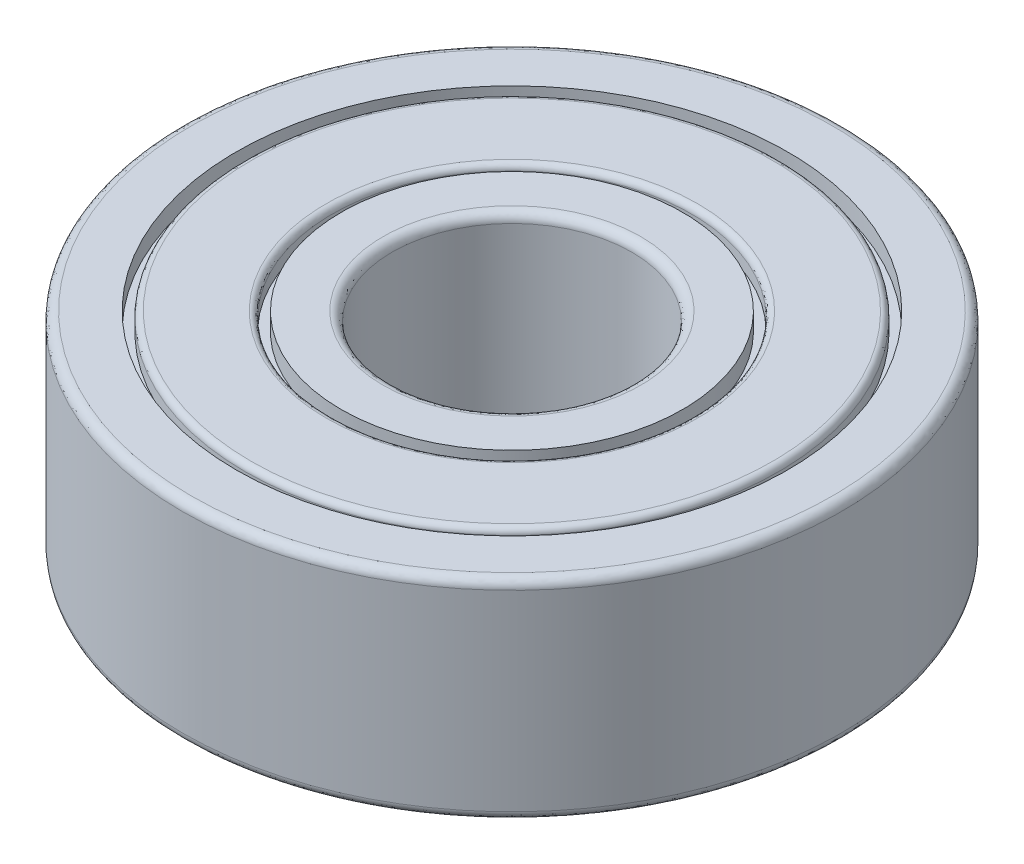
ISO-10303-21;
HEADER;
FILE_DESCRIPTION(('STEP AP214'),'2;1');
FILE_NAME('part.step','',(''),(''),'','','');
FILE_SCHEMA(('AUTOMOTIVE_DESIGN { 1 0 10303 214 1 1 1 1 }'));
ENDSEC;
DATA;
#1=APPLICATION_CONTEXT('core data for automotive mechanical design processes');
#2=APPLICATION_PROTOCOL_DEFINITION('international standard','automotive_design',2000,#1);
#3=PRODUCT_CONTEXT('',#1,'mechanical');
#4=PRODUCT('Part','Part','',(#3));
#5=PRODUCT_RELATED_PRODUCT_CATEGORY('part','',(#4));
#6=PRODUCT_DEFINITION_FORMATION('','',#4);
#7=PRODUCT_DEFINITION_CONTEXT('part definition',#1,'design');
#8=PRODUCT_DEFINITION('design','',#6,#7);
#9=PRODUCT_DEFINITION_SHAPE('','',#8);
#10=(LENGTH_UNIT() NAMED_UNIT(*) SI_UNIT(.MILLI.,.METRE.));
#11=(NAMED_UNIT(*) PLANE_ANGLE_UNIT() SI_UNIT($,.RADIAN.));
#12=(NAMED_UNIT(*) SI_UNIT($,.STERADIAN.) SOLID_ANGLE_UNIT());
#13=UNCERTAINTY_MEASURE_WITH_UNIT(LENGTH_MEASURE(1.E-05),#10,'distance_accuracy_value','');
#14=(GEOMETRIC_REPRESENTATION_CONTEXT(3) GLOBAL_UNCERTAINTY_ASSIGNED_CONTEXT((#13)) GLOBAL_UNIT_ASSIGNED_CONTEXT((#10,
#11,#12)) REPRESENTATION_CONTEXT('',''));
#15=CARTESIAN_POINT('',(0.,0.,0.));
#16=DIRECTION('',(0.,0.,1.));
#17=DIRECTION('',(1.,0.,0.));
#18=AXIS2_PLACEMENT_3D('',#15,#16,#17);
#19=CARTESIAN_POINT('',(0.,3.2,0.));
#20=DIRECTION('',(0.,-1.,0.));
#21=DIRECTION('',(0.,0.,1.));
#22=AXIS2_PLACEMENT_3D('',#19,#20,#21);
#23=CYLINDRICAL_SURFACE('',#22,4.);
#24=CARTESIAN_POINT('',(0.,3.2,0.));
#25=DIRECTION('',(0.,1.,0.));
#26=DIRECTION('',(0.,0.,1.));
#27=AXIS2_PLACEMENT_3D('',#24,#25,#26);
#28=CIRCLE('',#27,4.);
#29=CARTESIAN_POINT('',(0.,3.2,4.));
#30=VERTEX_POINT('',#29);
#31=EDGE_CURVE('E212',#30,#30,#28,.T.);
#32=ORIENTED_EDGE('',*,*,#31,.T.);
#33=CARTESIAN_POINT('',(0.,3.2,4.));
#34=CARTESIAN_POINT('',(0.,-3.2,4.));
#35=(BOUNDED_CURVE() B_SPLINE_CURVE(1,(#33,#34),.UNSPECIFIED.,.F.,
.F.) B_SPLINE_CURVE_WITH_KNOTS((2,2),(0.,6.4),
.UNSPECIFIED.) CURVE() GEOMETRIC_REPRESENTATION_ITEM() RATIONAL_B_SPLINE_CURVE((1.,1.)) REPRESENTATION_ITEM(''));
#36=CARTESIAN_POINT('',(0.,-3.2,4.));
#37=VERTEX_POINT('',#36);
#38=EDGE_CURVE('E11',#30,#37,#35,.T.);
#39=ORIENTED_EDGE('',*,*,#38,.T.);
#40=CARTESIAN_POINT('',(0.,-3.2,0.));
#41=DIRECTION('',(0.,1.,0.));
#42=DIRECTION('',(0.,0.,1.));
#43=AXIS2_PLACEMENT_3D('',#40,#41,#42);
#44=CIRCLE('',#43,4.);
#45=EDGE_CURVE('E237',#37,#37,#44,.T.);
#46=ORIENTED_EDGE('',*,*,#45,.F.);
#47=ORIENTED_EDGE('',*,*,#38,.F.);
#48=EDGE_LOOP('',(#32,#39,#46,#47));
#49=FACE_BOUND('',#48,.T.);
#50=ADVANCED_FACE('F16',(#49),#23,.F.);
#51=CARTESIAN_POINT('',(0.,-3.2,4.));
#52=CARTESIAN_POINT('',(0.,-3.37573593128807,4.));
#53=CARTESIAN_POINT('',(0.,-3.5,4.12426406871193));
#54=CARTESIAN_POINT('',(0.,-3.5,4.3));
#55=(BOUNDED_CURVE() B_SPLINE_CURVE(3,(#51,#52,#53,#54),.UNSPECIFIED.,.F.,
.F.) B_SPLINE_CURVE_WITH_KNOTS((4,4),(0.,1.),
.UNSPECIFIED.) CURVE() GEOMETRIC_REPRESENTATION_ITEM() RATIONAL_B_SPLINE_CURVE((1.,
0.804737854124365,0.804737854124365,1.)) REPRESENTATION_ITEM(''));
#56=CARTESIAN_POINT('',(0.,0.,0.));
#57=DIRECTION('',(0.,-1.,0.));
#58=AXIS1_PLACEMENT('',#56,#57);
#59=SURFACE_OF_REVOLUTION('',#55,#58);
#60=ORIENTED_EDGE('',*,*,#45,.T.);
#61=CARTESIAN_POINT('',(0.,-3.2,4.3));
#62=DIRECTION('',(-1.,0.,0.));
#63=DIRECTION('',(0.,-1.,0.));
#64=AXIS2_PLACEMENT_3D('',#61,#62,#63);
#65=CIRCLE('',#64,0.3);
#66=CARTESIAN_POINT('',(0.,-3.5,4.3));
#67=VERTEX_POINT('',#66);
#68=EDGE_CURVE('E29',#37,#67,#65,.T.);
#69=ORIENTED_EDGE('',*,*,#68,.T.);
#70=CARTESIAN_POINT('',(0.,-3.5,0.));
#71=DIRECTION('',(0.,1.,0.));
#72=DIRECTION('',(0.,0.,1.));
#73=AXIS2_PLACEMENT_3D('',#70,#71,#72);
#74=CIRCLE('',#73,4.3);
#75=EDGE_CURVE('E671',#67,#67,#74,.T.);
#76=ORIENTED_EDGE('',*,*,#75,.F.);
#77=ORIENTED_EDGE('',*,*,#68,.F.);
#78=EDGE_LOOP('',(#60,#69,#76,#77));
#79=FACE_BOUND('',#78,.T.);
#80=ADVANCED_FACE('F254',(#79),#59,.F.);
#81=CARTESIAN_POINT('',(0.,-3.5,0.));
#82=DIRECTION('',(0.,-1.,0.));
#83=DIRECTION('',(-1.,0.,0.));
#84=AXIS2_PLACEMENT_3D('',#81,#82,#83);
#85=PLANE('',#84);
#86=ORIENTED_EDGE('',*,*,#75,.T.);
#87=EDGE_LOOP('',(#86));
#88=FACE_BOUND('',#87,.T.);
#89=CARTESIAN_POINT('',(0.,-3.5,0.));
#90=DIRECTION('',(0.,1.,0.));
#91=DIRECTION('',(0.,0.,1.));
#92=AXIS2_PLACEMENT_3D('',#89,#90,#91);
#93=CIRCLE('',#92,5.7);
#94=CARTESIAN_POINT('',(0.,-3.5,5.7));
#95=VERTEX_POINT('',#94);
#96=EDGE_CURVE('E227',#95,#95,#93,.T.);
#97=ORIENTED_EDGE('',*,*,#96,.F.);
#98=EDGE_LOOP('',(#97));
#99=FACE_BOUND('',#98,.T.);
#100=ADVANCED_FACE('F258',(#88,#99),#85,.T.);
#101=CARTESIAN_POINT('',(0.,-2.9,0.));
#102=DIRECTION('',(0.,-1.,0.));
#103=DIRECTION('',(0.,0.,1.));
#104=AXIS2_PLACEMENT_3D('',#101,#102,#103);
#105=CYLINDRICAL_SURFACE('',#104,5.7);
#106=DIRECTION('',(0.,-1.,0.));
#107=VECTOR('',#106,1.);
#108=CARTESIAN_POINT('',(0.,-2.9,5.7));
#109=LINE('',#108,#107);
#110=CARTESIAN_POINT('',(0.,-2.9,5.7));
#111=VERTEX_POINT('',#110);
#112=EDGE_CURVE('E223',#111,#95,#109,.T.);
#113=ORIENTED_EDGE('',*,*,#112,.T.);
#114=ORIENTED_EDGE('',*,*,#96,.T.);
#115=ORIENTED_EDGE('',*,*,#112,.F.);
#116=CARTESIAN_POINT('',(0.,-2.9,0.));
#117=DIRECTION('',(0.,1.,0.));
#118=DIRECTION('',(0.,0.,1.));
#119=AXIS2_PLACEMENT_3D('',#116,#117,#118);
#120=CIRCLE('',#119,5.7);
#121=EDGE_CURVE('E228',#111,#111,#120,.T.);
#122=ORIENTED_EDGE('',*,*,#121,.F.);
#123=EDGE_LOOP('',(#113,#114,#115,#122));
#124=FACE_BOUND('',#123,.T.);
#125=ADVANCED_FACE('F366',(#124),#105,.T.);
#126=CARTESIAN_POINT('',(0.,-2.9,0.));
#127=DIRECTION('',(0.,-1.,0.));
#128=DIRECTION('',(-1.,0.,0.));
#129=AXIS2_PLACEMENT_3D('',#126,#127,#128);
#130=PLANE('',#129);
#131=ORIENTED_EDGE('',*,*,#121,.T.);
#132=EDGE_LOOP('',(#131));
#133=FACE_BOUND('',#132,.T.);
#134=CARTESIAN_POINT('',(0.,-2.9,0.));
#135=DIRECTION('',(0.,1.,0.));
#136=DIRECTION('',(0.,0.,1.));
#137=AXIS2_PLACEMENT_3D('',#134,#135,#136);
#138=CIRCLE('',#137,6.);
#139=CARTESIAN_POINT('',(0.,-2.9,6.));
#140=VERTEX_POINT('',#139);
#141=EDGE_CURVE('E123',#140,#140,#138,.T.);
#142=ORIENTED_EDGE('',*,*,#141,.F.);
#143=EDGE_LOOP('',(#142));
#144=FACE_BOUND('',#143,.T.);
#145=ADVANCED_FACE('F364',(#133,#144),#130,.T.);
#146=CARTESIAN_POINT('',(0.,-3.3,0.));
#147=DIRECTION('',(0.,1.,0.));
#148=DIRECTION('',(0.,0.,1.));
#149=AXIS2_PLACEMENT_3D('',#146,#147,#148);
#150=CYLINDRICAL_SURFACE('',#149,6.);
#151=DIRECTION('',(0.,1.,0.));
#152=VECTOR('',#151,1.);
#153=CARTESIAN_POINT('',(0.,-3.3,6.));
#154=LINE('',#153,#152);
#155=CARTESIAN_POINT('',(0.,-3.3,6.));
#156=VERTEX_POINT('',#155);
#157=EDGE_CURVE('E130',#156,#140,#154,.T.);
#158=ORIENTED_EDGE('',*,*,#157,.T.);
#159=ORIENTED_EDGE('',*,*,#141,.T.);
#160=ORIENTED_EDGE('',*,*,#157,.F.);
#161=CARTESIAN_POINT('',(0.,-3.3,0.));
#162=DIRECTION('',(0.,1.,0.));
#163=DIRECTION('',(0.,0.,1.));
#164=AXIS2_PLACEMENT_3D('',#161,#162,#163);
#165=CIRCLE('',#164,6.);
#166=EDGE_CURVE('E220',#156,#156,#165,.T.);
#167=ORIENTED_EDGE('',*,*,#166,.F.);
#168=EDGE_LOOP('',(#158,#159,#160,#167));
#169=FACE_BOUND('',#168,.T.);
#170=ADVANCED_FACE('F266',(#169),#150,.F.);
#171=CARTESIAN_POINT('',(0.,-3.3,6.));
#172=CARTESIAN_POINT('',(0.,-3.41715728752538,6.));
#173=CARTESIAN_POINT('',(0.,-3.5,6.08284271247462));
#174=CARTESIAN_POINT('',(0.,-3.5,6.2));
#175=(BOUNDED_CURVE() B_SPLINE_CURVE(3,(#171,#172,#173,#174),.UNSPECIFIED.,.F.,
.F.) B_SPLINE_CURVE_WITH_KNOTS((4,4),(0.,1.),
.UNSPECIFIED.) CURVE() GEOMETRIC_REPRESENTATION_ITEM() RATIONAL_B_SPLINE_CURVE((1.,
0.804737854124365,0.804737854124365,1.)) REPRESENTATION_ITEM(''));
#176=CARTESIAN_POINT('',(0.,0.,0.));
#177=DIRECTION('',(0.,-1.,0.));
#178=AXIS1_PLACEMENT('',#176,#177);
#179=SURFACE_OF_REVOLUTION('',#175,#178);
#180=ORIENTED_EDGE('',*,*,#166,.T.);
#181=CARTESIAN_POINT('',(0.,-3.3,6.2));
#182=DIRECTION('',(-1.,0.,0.));
#183=DIRECTION('',(0.,-1.,0.));
#184=AXIS2_PLACEMENT_3D('',#181,#182,#183);
#185=CIRCLE('',#184,0.2);
#186=CARTESIAN_POINT('',(0.,-3.5,6.2));
#187=VERTEX_POINT('',#186);
#188=EDGE_CURVE('E217',#156,#187,#185,.T.);
#189=ORIENTED_EDGE('',*,*,#188,.T.);
#190=CARTESIAN_POINT('',(0.,-3.5,0.));
#191=DIRECTION('',(0.,1.,0.));
#192=DIRECTION('',(0.,0.,1.));
#193=AXIS2_PLACEMENT_3D('',#190,#191,#192);
#194=CIRCLE('',#193,6.2);
#195=EDGE_CURVE('E641',#187,#187,#194,.T.);
#196=ORIENTED_EDGE('',*,*,#195,.F.);
#197=ORIENTED_EDGE('',*,*,#188,.F.);
#198=EDGE_LOOP('',(#180,#189,#196,#197));
#199=FACE_BOUND('',#198,.T.);
#200=ADVANCED_FACE('F262',(#199),#179,.F.);
#201=CARTESIAN_POINT('',(0.,-3.5,0.));
#202=DIRECTION('',(0.,-1.,0.));
#203=DIRECTION('',(-1.,0.,0.));
#204=AXIS2_PLACEMENT_3D('',#201,#202,#203);
#205=PLANE('',#204);
#206=ORIENTED_EDGE('',*,*,#195,.T.);
#207=EDGE_LOOP('',(#206));
#208=FACE_BOUND('',#207,.T.);
#209=CARTESIAN_POINT('',(0.,-3.5,0.));
#210=DIRECTION('',(0.,1.,0.));
#211=DIRECTION('',(0.,0.,1.));
#212=AXIS2_PLACEMENT_3D('',#209,#210,#211);
#213=CIRCLE('',#212,8.7);
#214=CARTESIAN_POINT('',(0.,-3.5,8.7));
#215=VERTEX_POINT('',#214);
#216=EDGE_CURVE('E229',#215,#215,#213,.T.);
#217=ORIENTED_EDGE('',*,*,#216,.F.);
#218=EDGE_LOOP('',(#217));
#219=FACE_BOUND('',#218,.T.);
#220=ADVANCED_FACE('F265',(#208,#219),#205,.T.);
#221=CARTESIAN_POINT('',(0.,-3.5,8.7));
#222=CARTESIAN_POINT('',(0.,-3.5,8.81715728752539));
#223=CARTESIAN_POINT('',(0.,-3.41715728752538,8.9));
#224=CARTESIAN_POINT('',(0.,-3.3,8.9));
#225=(BOUNDED_CURVE() B_SPLINE_CURVE(3,(#221,#222,#223,#224),.UNSPECIFIED.,.F.,
.F.) B_SPLINE_CURVE_WITH_KNOTS((4,4),(0.,1.),
.UNSPECIFIED.) CURVE() GEOMETRIC_REPRESENTATION_ITEM() RATIONAL_B_SPLINE_CURVE((1.,
0.804737854124365,0.804737854124365,1.)) REPRESENTATION_ITEM(''));
#226=CARTESIAN_POINT('',(0.,0.,0.));
#227=DIRECTION('',(0.,-1.,0.));
#228=AXIS1_PLACEMENT('',#226,#227);
#229=SURFACE_OF_REVOLUTION('',#225,#228);
#230=ORIENTED_EDGE('',*,*,#216,.T.);
#231=CARTESIAN_POINT('',(0.,-3.3,8.7));
#232=DIRECTION('',(-1.,0.,0.));
#233=DIRECTION('',(0.,-1.,0.));
#234=AXIS2_PLACEMENT_3D('',#231,#232,#233);
#235=CIRCLE('',#234,0.2);
#236=CARTESIAN_POINT('',(0.,-3.3,8.9));
#237=VERTEX_POINT('',#236);
#238=EDGE_CURVE('E233',#215,#237,#235,.T.);
#239=ORIENTED_EDGE('',*,*,#238,.T.);
#240=CARTESIAN_POINT('',(0.,-3.3,0.));
#241=DIRECTION('',(0.,1.,0.));
#242=DIRECTION('',(0.,0.,1.));
#243=AXIS2_PLACEMENT_3D('',#240,#241,#242);
#244=CIRCLE('',#243,8.9);
#245=EDGE_CURVE('E234',#237,#237,#244,.T.);
#246=ORIENTED_EDGE('',*,*,#245,.F.);
#247=ORIENTED_EDGE('',*,*,#238,.F.);
#248=EDGE_LOOP('',(#230,#239,#246,#247));
#249=FACE_BOUND('',#248,.T.);
#250=ADVANCED_FACE('F268',(#249),#229,.F.);
#251=CARTESIAN_POINT('',(0.,-2.9,0.));
#252=DIRECTION('',(0.,-1.,0.));
#253=DIRECTION('',(0.,0.,1.));
#254=AXIS2_PLACEMENT_3D('',#251,#252,#253);
#255=CYLINDRICAL_SURFACE('',#254,8.9);
#256=DIRECTION('',(0.,-1.,0.));
#257=VECTOR('',#256,1.);
#258=CARTESIAN_POINT('',(0.,-2.9,8.9));
#259=LINE('',#258,#257);
#260=CARTESIAN_POINT('',(0.,-2.9,8.9));
#261=VERTEX_POINT('',#260);
#262=EDGE_CURVE('E241',#261,#237,#259,.T.);
#263=ORIENTED_EDGE('',*,*,#262,.T.);
#264=ORIENTED_EDGE('',*,*,#245,.T.);
#265=ORIENTED_EDGE('',*,*,#262,.F.);
#266=CARTESIAN_POINT('',(0.,-2.9,0.));
#267=DIRECTION('',(0.,1.,0.));
#268=DIRECTION('',(0.,0.,1.));
#269=AXIS2_PLACEMENT_3D('',#266,#267,#268);
#270=CIRCLE('',#269,8.9);
#271=EDGE_CURVE('E732',#261,#261,#270,.T.);
#272=ORIENTED_EDGE('',*,*,#271,.F.);
#273=EDGE_LOOP('',(#263,#264,#265,#272));
#274=FACE_BOUND('',#273,.T.);
#275=ADVANCED_FACE('F271',(#274),#255,.T.);
#276=CARTESIAN_POINT('',(0.,-2.9,0.));
#277=DIRECTION('',(0.,-1.,0.));
#278=DIRECTION('',(-1.,0.,0.));
#279=AXIS2_PLACEMENT_3D('',#276,#277,#278);
#280=PLANE('',#279);
#281=ORIENTED_EDGE('',*,*,#271,.T.);
#282=EDGE_LOOP('',(#281));
#283=FACE_BOUND('',#282,.T.);
#284=CARTESIAN_POINT('',(0.,-2.9,0.));
#285=DIRECTION('',(0.,1.,0.));
#286=DIRECTION('',(0.,0.,1.));
#287=AXIS2_PLACEMENT_3D('',#284,#285,#286);
#288=CIRCLE('',#287,9.2);
#289=CARTESIAN_POINT('',(0.,-2.9,9.2));
#290=VERTEX_POINT('',#289);
#291=EDGE_CURVE('E194',#290,#290,#288,.T.);
#292=ORIENTED_EDGE('',*,*,#291,.F.);
#293=EDGE_LOOP('',(#292));
#294=FACE_BOUND('',#293,.T.);
#295=ADVANCED_FACE('F337',(#283,#294),#280,.T.);
#296=CARTESIAN_POINT('',(0.,-3.5,0.));
#297=DIRECTION('',(0.,1.,0.));
#298=DIRECTION('',(0.,0.,1.));
#299=AXIS2_PLACEMENT_3D('',#296,#297,#298);
#300=CYLINDRICAL_SURFACE('',#299,9.2);
#301=DIRECTION('',(0.,1.,0.));
#302=VECTOR('',#301,1.);
#303=CARTESIAN_POINT('',(0.,-3.5,9.2));
#304=LINE('',#303,#302);
#305=CARTESIAN_POINT('',(0.,-3.5,9.2));
#306=VERTEX_POINT('',#305);
#307=EDGE_CURVE('E188',#306,#290,#304,.T.);
#308=ORIENTED_EDGE('',*,*,#307,.T.);
#309=ORIENTED_EDGE('',*,*,#291,.T.);
#310=ORIENTED_EDGE('',*,*,#307,.F.);
#311=CARTESIAN_POINT('',(0.,-3.5,0.));
#312=DIRECTION('',(0.,1.,0.));
#313=DIRECTION('',(0.,0.,1.));
#314=AXIS2_PLACEMENT_3D('',#311,#312,#313);
#315=CIRCLE('',#314,9.2);
#316=EDGE_CURVE('E181',#306,#306,#315,.T.);
#317=ORIENTED_EDGE('',*,*,#316,.F.);
#318=EDGE_LOOP('',(#308,#309,#310,#317));
#319=FACE_BOUND('',#318,.T.);
#320=ADVANCED_FACE('F341',(#319),#300,.F.);
#321=CARTESIAN_POINT('',(0.,-3.5,0.));
#322=DIRECTION('',(0.,-1.,0.));
#323=DIRECTION('',(-1.,0.,0.));
#324=AXIS2_PLACEMENT_3D('',#321,#322,#323);
#325=PLANE('',#324);
#326=ORIENTED_EDGE('',*,*,#316,.T.);
#327=EDGE_LOOP('',(#326));
#328=FACE_BOUND('',#327,.T.);
#329=CARTESIAN_POINT('',(0.,-3.5,0.));
#330=DIRECTION('',(0.,1.,0.));
#331=DIRECTION('',(0.,0.,1.));
#332=AXIS2_PLACEMENT_3D('',#329,#330,#331);
#333=CIRCLE('',#332,10.7);
#334=CARTESIAN_POINT('',(0.,-3.5,10.7));
#335=VERTEX_POINT('',#334);
#336=EDGE_CURVE('E176',#335,#335,#333,.T.);
#337=ORIENTED_EDGE('',*,*,#336,.F.);
#338=EDGE_LOOP('',(#337));
#339=FACE_BOUND('',#338,.T.);
#340=ADVANCED_FACE('F260',(#328,#339),#325,.T.);
#341=CARTESIAN_POINT('',(0.,-3.5,10.7));
#342=CARTESIAN_POINT('',(0.,-3.5,10.8757359312881));
#343=CARTESIAN_POINT('',(0.,-3.37573593128807,11.));
#344=CARTESIAN_POINT('',(0.,-3.2,11.));
#345=(BOUNDED_CURVE() B_SPLINE_CURVE(3,(#341,#342,#343,#344),.UNSPECIFIED.,.F.,
.F.) B_SPLINE_CURVE_WITH_KNOTS((4,4),(0.,1.),
.UNSPECIFIED.) CURVE() GEOMETRIC_REPRESENTATION_ITEM() RATIONAL_B_SPLINE_CURVE((1.,
0.804737854124365,0.804737854124365,1.)) REPRESENTATION_ITEM(''));
#346=CARTESIAN_POINT('',(0.,0.,0.));
#347=DIRECTION('',(0.,-1.,0.));
#348=AXIS1_PLACEMENT('',#346,#347);
#349=SURFACE_OF_REVOLUTION('',#345,#348);
#350=ORIENTED_EDGE('',*,*,#336,.T.);
#351=CARTESIAN_POINT('',(0.,-3.2,10.7));
#352=DIRECTION('',(-1.,0.,0.));
#353=DIRECTION('',(0.,-1.,0.));
#354=AXIS2_PLACEMENT_3D('',#351,#352,#353);
#355=CIRCLE('',#354,0.3);
#356=CARTESIAN_POINT('',(0.,-3.2,11.));
#357=VERTEX_POINT('',#356);
#358=EDGE_CURVE('E173',#335,#357,#355,.T.);
#359=ORIENTED_EDGE('',*,*,#358,.T.);
#360=CARTESIAN_POINT('',(0.,-3.2,0.));
#361=DIRECTION('',(0.,1.,0.));
#362=DIRECTION('',(0.,0.,1.));
#363=AXIS2_PLACEMENT_3D('',#360,#361,#362);
#364=CIRCLE('',#363,11.);
#365=EDGE_CURVE('E178',#357,#357,#364,.T.);
#366=ORIENTED_EDGE('',*,*,#365,.F.);
#367=ORIENTED_EDGE('',*,*,#358,.F.);
#368=EDGE_LOOP('',(#350,#359,#366,#367));
#369=FACE_BOUND('',#368,.T.);
#370=ADVANCED_FACE('F174',(#369),#349,.F.);
#371=CARTESIAN_POINT('',(0.,0.,0.));
#372=DIRECTION('',(0.,1.,0.));
#373=DIRECTION('',(0.,0.,1.));
#374=AXIS2_PLACEMENT_3D('',#371,#372,#373);
#375=CYLINDRICAL_SURFACE('',#374,11.);
#376=CARTESIAN_POINT('',(0.,3.2,0.));
#377=DIRECTION('',(0.,1.,0.));
#378=DIRECTION('',(0.,0.,1.));
#379=AXIS2_PLACEMENT_3D('',#376,#377,#378);
#380=CIRCLE('',#379,11.);
#381=CARTESIAN_POINT('',(0.,3.2,11.));
#382=VERTEX_POINT('',#381);
#383=EDGE_CURVE('E659',#382,#382,#380,.T.);
#384=ORIENTED_EDGE('',*,*,#383,.F.);
#385=CARTESIAN_POINT('',(0.,-3.2,11.));
#386=CARTESIAN_POINT('',(0.,3.2,11.));
#387=(BOUNDED_CURVE() B_SPLINE_CURVE(1,(#385,#386),.UNSPECIFIED.,.F.,
.F.) B_SPLINE_CURVE_WITH_KNOTS((2,2),(-3.2,3.2),
.UNSPECIFIED.) CURVE() GEOMETRIC_REPRESENTATION_ITEM() RATIONAL_B_SPLINE_CURVE((1.,1.)) REPRESENTATION_ITEM(''));
#388=EDGE_CURVE('E215',#357,#382,#387,.T.);
#389=ORIENTED_EDGE('',*,*,#388,.F.);
#390=ORIENTED_EDGE('',*,*,#365,.T.);
#391=ORIENTED_EDGE('',*,*,#388,.T.);
#392=EDGE_LOOP('',(#384,#389,#390,#391));
#393=FACE_BOUND('',#392,.T.);
#394=ADVANCED_FACE('F302',(#393),#375,.T.);
#395=CARTESIAN_POINT('',(0.,3.2,4.));
#396=CARTESIAN_POINT('',(0.,3.37573593128807,4.));
#397=CARTESIAN_POINT('',(0.,3.5,4.12426406871192));
#398=CARTESIAN_POINT('',(0.,3.5,4.3));
#399=(BOUNDED_CURVE() B_SPLINE_CURVE(3,(#395,#396,#397,#398),.UNSPECIFIED.,.F.,
.F.) B_SPLINE_CURVE_WITH_KNOTS((4,4),(0.,1.),
.UNSPECIFIED.) CURVE() GEOMETRIC_REPRESENTATION_ITEM() RATIONAL_B_SPLINE_CURVE((1.,
0.804737854124366,0.804737854124366,1.)) REPRESENTATION_ITEM(''));
#400=CARTESIAN_POINT('',(0.,0.,0.));
#401=DIRECTION('',(0.,-1.,0.));
#402=AXIS1_PLACEMENT('',#400,#401);
#403=SURFACE_OF_REVOLUTION('',#399,#402);
#404=CARTESIAN_POINT('',(0.,3.5,0.));
#405=DIRECTION('',(0.,1.,0.));
#406=DIRECTION('',(0.,0.,1.));
#407=AXIS2_PLACEMENT_3D('',#404,#405,#406);
#408=CIRCLE('',#407,4.3);
#409=CARTESIAN_POINT('',(0.,3.5,4.3));
#410=VERTEX_POINT('',#409);
#411=EDGE_CURVE('E211',#410,#410,#408,.T.);
#412=ORIENTED_EDGE('',*,*,#411,.T.);
#413=CARTESIAN_POINT('',(0.,3.2,4.3));
#414=DIRECTION('',(1.,0.,0.));
#415=DIRECTION('',(0.,1.,0.));
#416=AXIS2_PLACEMENT_3D('',#413,#414,#415);
#417=CIRCLE('',#416,0.3);
#418=EDGE_CURVE('E216',#30,#410,#417,.T.);
#419=ORIENTED_EDGE('',*,*,#418,.F.);
#420=ORIENTED_EDGE('',*,*,#31,.F.);
#421=ORIENTED_EDGE('',*,*,#418,.T.);
#422=EDGE_LOOP('',(#412,#419,#420,#421));
#423=FACE_BOUND('',#422,.T.);
#424=ADVANCED_FACE('F298',(#423),#403,.T.);
#425=CARTESIAN_POINT('',(0.,3.5,0.));
#426=DIRECTION('',(0.,1.,0.));
#427=DIRECTION('',(0.,0.,-1.));
#428=AXIS2_PLACEMENT_3D('',#425,#426,#427);
#429=PLANE('',#428);
#430=ORIENTED_EDGE('',*,*,#411,.F.);
#431=EDGE_LOOP('',(#430));
#432=FACE_BOUND('',#431,.T.);
#433=CARTESIAN_POINT('',(0.,3.5,0.));
#434=DIRECTION('',(0.,1.,0.));
#435=DIRECTION('',(0.,0.,1.));
#436=AXIS2_PLACEMENT_3D('',#433,#434,#435);
#437=CIRCLE('',#436,5.7);
#438=CARTESIAN_POINT('',(0.,3.5,5.7));
#439=VERTEX_POINT('',#438);
#440=EDGE_CURVE('E198',#439,#439,#437,.T.);
#441=ORIENTED_EDGE('',*,*,#440,.T.);
#442=EDGE_LOOP('',(#441));
#443=FACE_BOUND('',#442,.T.);
#444=ADVANCED_FACE('F301',(#432,#443),#429,.T.);
#445=CARTESIAN_POINT('',(0.,2.9,0.));
#446=DIRECTION('',(0.,1.,0.));
#447=DIRECTION('',(0.,0.,1.));
#448=AXIS2_PLACEMENT_3D('',#445,#446,#447);
#449=CYLINDRICAL_SURFACE('',#448,5.7);
#450=DIRECTION('',(0.,1.,0.));
#451=VECTOR('',#450,1.);
#452=CARTESIAN_POINT('',(0.,2.9,5.7));
#453=LINE('',#452,#451);
#454=CARTESIAN_POINT('',(0.,2.9,5.7));
#455=VERTEX_POINT('',#454);
#456=EDGE_CURVE('E196',#455,#439,#453,.T.);
#457=ORIENTED_EDGE('',*,*,#456,.F.);
#458=CARTESIAN_POINT('',(0.,2.9,0.));
#459=DIRECTION('',(0.,1.,0.));
#460=DIRECTION('',(0.,0.,1.));
#461=AXIS2_PLACEMENT_3D('',#458,#459,#460);
#462=CIRCLE('',#461,5.7);
#463=EDGE_CURVE('E199',#455,#455,#462,.T.);
#464=ORIENTED_EDGE('',*,*,#463,.T.);
#465=ORIENTED_EDGE('',*,*,#456,.T.);
#466=ORIENTED_EDGE('',*,*,#440,.F.);
#467=EDGE_LOOP('',(#457,#464,#465,#466));
#468=FACE_BOUND('',#467,.T.);
#469=ADVANCED_FACE('F356',(#468),#449,.T.);
#470=CARTESIAN_POINT('',(0.,2.9,0.));
#471=DIRECTION('',(0.,1.,0.));
#472=DIRECTION('',(0.,0.,-1.));
#473=AXIS2_PLACEMENT_3D('',#470,#471,#472);
#474=PLANE('',#473);
#475=ORIENTED_EDGE('',*,*,#463,.F.);
#476=EDGE_LOOP('',(#475));
#477=FACE_BOUND('',#476,.T.);
#478=CARTESIAN_POINT('',(0.,2.9,0.));
#479=DIRECTION('',(0.,1.,0.));
#480=DIRECTION('',(0.,0.,1.));
#481=AXIS2_PLACEMENT_3D('',#478,#479,#480);
#482=CIRCLE('',#481,6.);
#483=CARTESIAN_POINT('',(0.,2.9,6.));
#484=VERTEX_POINT('',#483);
#485=EDGE_CURVE('E683',#484,#484,#482,.T.);
#486=ORIENTED_EDGE('',*,*,#485,.T.);
#487=EDGE_LOOP('',(#486));
#488=FACE_BOUND('',#487,.T.);
#489=ADVANCED_FACE('F352',(#477,#488),#474,.T.);
#490=CARTESIAN_POINT('',(0.,3.3,0.));
#491=DIRECTION('',(0.,-1.,0.));
#492=DIRECTION('',(0.,0.,1.));
#493=AXIS2_PLACEMENT_3D('',#490,#491,#492);
#494=CYLINDRICAL_SURFACE('',#493,6.);
#495=DIRECTION('',(0.,-1.,0.));
#496=VECTOR('',#495,1.);
#497=CARTESIAN_POINT('',(0.,3.3,6.));
#498=LINE('',#497,#496);
#499=CARTESIAN_POINT('',(0.,3.3,6.));
#500=VERTEX_POINT('',#499);
#501=EDGE_CURVE('E667',#500,#484,#498,.T.);
#502=ORIENTED_EDGE('',*,*,#501,.F.);
#503=CARTESIAN_POINT('',(0.,3.3,0.));
#504=DIRECTION('',(0.,1.,0.));
#505=DIRECTION('',(0.,0.,1.));
#506=AXIS2_PLACEMENT_3D('',#503,#504,#505);
#507=CIRCLE('',#506,6.);
#508=EDGE_CURVE('E663',#500,#500,#507,.T.);
#509=ORIENTED_EDGE('',*,*,#508,.T.);
#510=ORIENTED_EDGE('',*,*,#501,.T.);
#511=ORIENTED_EDGE('',*,*,#485,.F.);
#512=EDGE_LOOP('',(#502,#509,#510,#511));
#513=FACE_BOUND('',#512,.T.);
#514=ADVANCED_FACE('F307',(#513),#494,.F.);
#515=CARTESIAN_POINT('',(0.,3.3,6.));
#516=CARTESIAN_POINT('',(0.,3.41715728752538,6.));
#517=CARTESIAN_POINT('',(0.,3.5,6.08284271247462));
#518=CARTESIAN_POINT('',(0.,3.5,6.2));
#519=(BOUNDED_CURVE() B_SPLINE_CURVE(3,(#515,#516,#517,#518),.UNSPECIFIED.,.F.,
.F.) B_SPLINE_CURVE_WITH_KNOTS((4,4),(0.,1.),
.UNSPECIFIED.) CURVE() GEOMETRIC_REPRESENTATION_ITEM() RATIONAL_B_SPLINE_CURVE((1.,
0.804737854124365,0.804737854124365,1.)) REPRESENTATION_ITEM(''));
#520=CARTESIAN_POINT('',(0.,0.,0.));
#521=DIRECTION('',(0.,-1.,0.));
#522=AXIS1_PLACEMENT('',#520,#521);
#523=SURFACE_OF_REVOLUTION('',#519,#522);
#524=CARTESIAN_POINT('',(0.,3.5,0.));
#525=DIRECTION('',(0.,1.,0.));
#526=DIRECTION('',(0.,0.,1.));
#527=AXIS2_PLACEMENT_3D('',#524,#525,#526);
#528=CIRCLE('',#527,6.2);
#529=CARTESIAN_POINT('',(0.,3.5,6.2));
#530=VERTEX_POINT('',#529);
#531=EDGE_CURVE('E692',#530,#530,#528,.T.);
#532=ORIENTED_EDGE('',*,*,#531,.T.);
#533=CARTESIAN_POINT('',(0.,3.3,6.2));
#534=DIRECTION('',(1.,0.,0.));
#535=DIRECTION('',(0.,1.,0.));
#536=AXIS2_PLACEMENT_3D('',#533,#534,#535);
#537=CIRCLE('',#536,0.2);
#538=EDGE_CURVE('E668',#500,#530,#537,.T.);
#539=ORIENTED_EDGE('',*,*,#538,.F.);
#540=ORIENTED_EDGE('',*,*,#508,.F.);
#541=ORIENTED_EDGE('',*,*,#538,.T.);
#542=EDGE_LOOP('',(#532,#539,#540,#541));
#543=FACE_BOUND('',#542,.T.);
#544=ADVANCED_FACE('F304',(#543),#523,.T.);
#545=CARTESIAN_POINT('',(0.,3.5,0.));
#546=DIRECTION('',(0.,1.,0.));
#547=DIRECTION('',(0.,0.,-1.));
#548=AXIS2_PLACEMENT_3D('',#545,#546,#547);
#549=PLANE('',#548);
#550=ORIENTED_EDGE('',*,*,#531,.F.);
#551=EDGE_LOOP('',(#550));
#552=FACE_BOUND('',#551,.T.);
#553=CARTESIAN_POINT('',(0.,3.5,0.));
#554=DIRECTION('',(0.,1.,0.));
#555=DIRECTION('',(0.,0.,1.));
#556=AXIS2_PLACEMENT_3D('',#553,#554,#555);
#557=CIRCLE('',#556,8.7);
#558=CARTESIAN_POINT('',(0.,3.5,8.7));
#559=VERTEX_POINT('',#558);
#560=EDGE_CURVE('E689',#559,#559,#557,.T.);
#561=ORIENTED_EDGE('',*,*,#560,.T.);
#562=EDGE_LOOP('',(#561));
#563=FACE_BOUND('',#562,.T.);
#564=ADVANCED_FACE('F306',(#552,#563),#549,.T.);
#565=CARTESIAN_POINT('',(0.,3.5,8.7));
#566=CARTESIAN_POINT('',(0.,3.5,8.81715728752538));
#567=CARTESIAN_POINT('',(0.,3.41715728752538,8.9));
#568=CARTESIAN_POINT('',(0.,3.3,8.9));
#569=(BOUNDED_CURVE() B_SPLINE_CURVE(3,(#565,#566,#567,#568),.UNSPECIFIED.,.F.,
.F.) B_SPLINE_CURVE_WITH_KNOTS((4,4),(0.,1.),
.UNSPECIFIED.) CURVE() GEOMETRIC_REPRESENTATION_ITEM() RATIONAL_B_SPLINE_CURVE((1.,
0.804737854124365,0.804737854124365,1.)) REPRESENTATION_ITEM(''));
#570=CARTESIAN_POINT('',(0.,0.,0.));
#571=DIRECTION('',(0.,-1.,0.));
#572=AXIS1_PLACEMENT('',#570,#571);
#573=SURFACE_OF_REVOLUTION('',#569,#572);
#574=CARTESIAN_POINT('',(0.,3.3,0.));
#575=DIRECTION('',(0.,1.,0.));
#576=DIRECTION('',(0.,0.,1.));
#577=AXIS2_PLACEMENT_3D('',#574,#575,#576);
#578=CIRCLE('',#577,8.9);
#579=CARTESIAN_POINT('',(0.,3.3,8.9));
#580=VERTEX_POINT('',#579);
#581=EDGE_CURVE('E203',#580,#580,#578,.T.);
#582=ORIENTED_EDGE('',*,*,#581,.T.);
#583=CARTESIAN_POINT('',(0.,3.3,8.7));
#584=DIRECTION('',(1.,0.,0.));
#585=DIRECTION('',(0.,1.,0.));
#586=AXIS2_PLACEMENT_3D('',#583,#584,#585);
#587=CIRCLE('',#586,0.2);
#588=EDGE_CURVE('E86',#559,#580,#587,.T.);
#589=ORIENTED_EDGE('',*,*,#588,.F.);
#590=ORIENTED_EDGE('',*,*,#560,.F.);
#591=ORIENTED_EDGE('',*,*,#588,.T.);
#592=EDGE_LOOP('',(#582,#589,#590,#591));
#593=FACE_BOUND('',#592,.T.);
#594=ADVANCED_FACE('F309',(#593),#573,.T.);
#595=CARTESIAN_POINT('',(0.,2.9,0.));
#596=DIRECTION('',(0.,1.,0.));
#597=DIRECTION('',(0.,0.,1.));
#598=AXIS2_PLACEMENT_3D('',#595,#596,#597);
#599=CYLINDRICAL_SURFACE('',#598,8.9);
#600=DIRECTION('',(0.,1.,0.));
#601=VECTOR('',#600,1.);
#602=CARTESIAN_POINT('',(0.,2.9,8.9));
#603=LINE('',#602,#601);
#604=CARTESIAN_POINT('',(0.,2.9,8.9));
#605=VERTEX_POINT('',#604);
#606=EDGE_CURVE('E100',#605,#580,#603,.T.);
#607=ORIENTED_EDGE('',*,*,#606,.F.);
#608=CARTESIAN_POINT('',(0.,2.9,0.));
#609=DIRECTION('',(0.,1.,0.));
#610=DIRECTION('',(0.,0.,1.));
#611=AXIS2_PLACEMENT_3D('',#608,#609,#610);
#612=CIRCLE('',#611,8.9);
#613=EDGE_CURVE('E204',#605,#605,#612,.T.);
#614=ORIENTED_EDGE('',*,*,#613,.T.);
#615=ORIENTED_EDGE('',*,*,#606,.T.);
#616=ORIENTED_EDGE('',*,*,#581,.F.);
#617=EDGE_LOOP('',(#607,#614,#615,#616));
#618=FACE_BOUND('',#617,.T.);
#619=ADVANCED_FACE('F311',(#618),#599,.T.);
#620=CARTESIAN_POINT('',(0.,2.9,0.));
#621=DIRECTION('',(0.,1.,0.));
#622=DIRECTION('',(0.,0.,-1.));
#623=AXIS2_PLACEMENT_3D('',#620,#621,#622);
#624=PLANE('',#623);
#625=ORIENTED_EDGE('',*,*,#613,.F.);
#626=EDGE_LOOP('',(#625));
#627=FACE_BOUND('',#626,.T.);
#628=CARTESIAN_POINT('',(0.,2.9,0.));
#629=DIRECTION('',(0.,1.,0.));
#630=DIRECTION('',(0.,0.,1.));
#631=AXIS2_PLACEMENT_3D('',#628,#629,#630);
#632=CIRCLE('',#631,9.2);
#633=CARTESIAN_POINT('',(0.,2.9,9.2));
#634=VERTEX_POINT('',#633);
#635=EDGE_CURVE('E207',#634,#634,#632,.T.);
#636=ORIENTED_EDGE('',*,*,#635,.T.);
#637=EDGE_LOOP('',(#636));
#638=FACE_BOUND('',#637,.T.);
#639=ADVANCED_FACE('F323',(#627,#638),#624,.T.);
#640=CARTESIAN_POINT('',(0.,3.5,0.));
#641=DIRECTION('',(0.,-1.,0.));
#642=DIRECTION('',(0.,0.,1.));
#643=AXIS2_PLACEMENT_3D('',#640,#641,#642);
#644=CYLINDRICAL_SURFACE('',#643,9.2);
#645=DIRECTION('',(0.,-1.,0.));
#646=VECTOR('',#645,1.);
#647=CARTESIAN_POINT('',(0.,3.5,9.2));
#648=LINE('',#647,#646);
#649=CARTESIAN_POINT('',(0.,3.5,9.2));
#650=VERTEX_POINT('',#649);
#651=EDGE_CURVE('E162',#650,#634,#648,.T.);
#652=ORIENTED_EDGE('',*,*,#651,.F.);
#653=CARTESIAN_POINT('',(0.,3.5,0.));
#654=DIRECTION('',(0.,1.,0.));
#655=DIRECTION('',(0.,0.,1.));
#656=AXIS2_PLACEMENT_3D('',#653,#654,#655);
#657=CIRCLE('',#656,9.2);
#658=EDGE_CURVE('E208',#650,#650,#657,.T.);
#659=ORIENTED_EDGE('',*,*,#658,.T.);
#660=ORIENTED_EDGE('',*,*,#651,.T.);
#661=ORIENTED_EDGE('',*,*,#635,.F.);
#662=EDGE_LOOP('',(#652,#659,#660,#661));
#663=FACE_BOUND('',#662,.T.);
#664=ADVANCED_FACE('F345',(#663),#644,.F.);
#665=CARTESIAN_POINT('',(0.,3.5,0.));
#666=DIRECTION('',(0.,1.,0.));
#667=DIRECTION('',(0.,0.,-1.));
#668=AXIS2_PLACEMENT_3D('',#665,#666,#667);
#669=PLANE('',#668);
#670=ORIENTED_EDGE('',*,*,#658,.F.);
#671=EDGE_LOOP('',(#670));
#672=FACE_BOUND('',#671,.T.);
#673=CARTESIAN_POINT('',(0.,3.5,0.));
#674=DIRECTION('',(0.,1.,0.));
#675=DIRECTION('',(0.,0.,1.));
#676=AXIS2_PLACEMENT_3D('',#673,#674,#675);
#677=CIRCLE('',#676,10.7);
#678=CARTESIAN_POINT('',(0.,3.5,10.7));
#679=VERTEX_POINT('',#678);
#680=EDGE_CURVE('E151',#679,#679,#677,.T.);
#681=ORIENTED_EDGE('',*,*,#680,.T.);
#682=EDGE_LOOP('',(#681));
#683=FACE_BOUND('',#682,.T.);
#684=ADVANCED_FACE('F332',(#672,#683),#669,.T.);
#685=CARTESIAN_POINT('',(0.,3.5,10.7));
#686=CARTESIAN_POINT('',(0.,3.5,10.8757359312881));
#687=CARTESIAN_POINT('',(0.,3.37573593128807,11.));
#688=CARTESIAN_POINT('',(0.,3.2,11.));
#689=(BOUNDED_CURVE() B_SPLINE_CURVE(3,(#685,#686,#687,#688),.UNSPECIFIED.,.F.,
.F.) B_SPLINE_CURVE_WITH_KNOTS((4,4),(0.,1.),
.UNSPECIFIED.) CURVE() GEOMETRIC_REPRESENTATION_ITEM() RATIONAL_B_SPLINE_CURVE((1.,
0.804737854124365,0.804737854124365,1.)) REPRESENTATION_ITEM(''));
#690=CARTESIAN_POINT('',(0.,0.,0.));
#691=DIRECTION('',(0.,-1.,0.));
#692=AXIS1_PLACEMENT('',#690,#691);
#693=SURFACE_OF_REVOLUTION('',#689,#692);
#694=ORIENTED_EDGE('',*,*,#383,.T.);
#695=CARTESIAN_POINT('',(0.,3.2,10.7));
#696=DIRECTION('',(1.,0.,0.));
#697=DIRECTION('',(0.,1.,0.));
#698=AXIS2_PLACEMENT_3D('',#695,#696,#697);
#699=CIRCLE('',#698,0.3);
#700=EDGE_CURVE('E656',#679,#382,#699,.T.);
#701=ORIENTED_EDGE('',*,*,#700,.F.);
#702=ORIENTED_EDGE('',*,*,#680,.F.);
#703=ORIENTED_EDGE('',*,*,#700,.T.);
#704=EDGE_LOOP('',(#694,#701,#702,#703));
#705=FACE_BOUND('',#704,.T.);
#706=ADVANCED_FACE('F18',(#705),#693,.T.);
#707=CLOSED_SHELL('',(#50,#80,#100,#125,#145,#170,#200,#220,#250,#275,#295,#320,#340,#370,#394,
#424,#444,#469,#489,#514,#544,#564,#594,#619,#639,#664,#684,#706));
#708=MANIFOLD_SOLID_BREP('B1',#707);
#709=ADVANCED_BREP_SHAPE_REPRESENTATION('',(#18,#708),#14);
#710=SHAPE_DEFINITION_REPRESENTATION(#9,#709);
ENDSEC;
END-ISO-10303-21;
